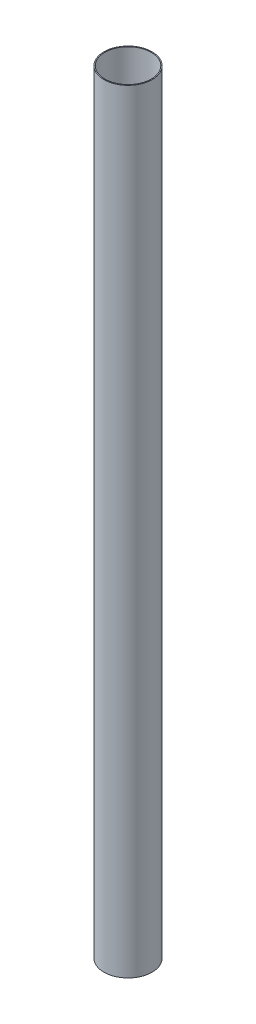
ISO-10303-21;
HEADER;
FILE_DESCRIPTION(('STEP AP214'),'2;1');
FILE_NAME('part.step','',(''),(''),'','','');
FILE_SCHEMA(('AUTOMOTIVE_DESIGN { 1 0 10303 214 1 1 1 1 }'));
ENDSEC;
DATA;
#1=APPLICATION_CONTEXT('core data for automotive mechanical design processes');
#2=APPLICATION_PROTOCOL_DEFINITION('international standard','automotive_design',2000,#1);
#3=PRODUCT_CONTEXT('',#1,'mechanical');
#4=PRODUCT('Part','Part','',(#3));
#5=PRODUCT_RELATED_PRODUCT_CATEGORY('part','',(#4));
#6=PRODUCT_DEFINITION_FORMATION('','',#4);
#7=PRODUCT_DEFINITION_CONTEXT('part definition',#1,'design');
#8=PRODUCT_DEFINITION('design','',#6,#7);
#9=PRODUCT_DEFINITION_SHAPE('','',#8);
#10=(LENGTH_UNIT() NAMED_UNIT(*) SI_UNIT(.MILLI.,.METRE.));
#11=(NAMED_UNIT(*) PLANE_ANGLE_UNIT() SI_UNIT($,.RADIAN.));
#12=(NAMED_UNIT(*) SI_UNIT($,.STERADIAN.) SOLID_ANGLE_UNIT());
#13=UNCERTAINTY_MEASURE_WITH_UNIT(LENGTH_MEASURE(1.E-05),#10,'distance_accuracy_value','');
#14=(GEOMETRIC_REPRESENTATION_CONTEXT(3) GLOBAL_UNCERTAINTY_ASSIGNED_CONTEXT((#13)) GLOBAL_UNIT_ASSIGNED_CONTEXT((#10,
#11,#12)) REPRESENTATION_CONTEXT('',''));
#15=CARTESIAN_POINT('',(0.,0.,0.));
#16=DIRECTION('',(0.,0.,1.));
#17=DIRECTION('',(1.,0.,0.));
#18=AXIS2_PLACEMENT_3D('',#15,#16,#17);
#19=CARTESIAN_POINT('',(0.,1270.,0.));
#20=DIRECTION('',(0.,1.,0.));
#21=DIRECTION('',(0.,0.,1.));
#22=AXIS2_PLACEMENT_3D('',#19,#20,#21);
#23=PLANE('',#22);
#24=CARTESIAN_POINT('',(0.,1270.,0.));
#25=DIRECTION('',(0.,1.,0.));
#26=DIRECTION('',(0.,0.,1.));
#27=AXIS2_PLACEMENT_3D('',#24,#25,#26);
#28=CIRCLE('',#27,39.624);
#29=CARTESIAN_POINT('',(0.,1270.,-39.624));
#30=VERTEX_POINT('',#29);
#31=EDGE_CURVE('E10',#30,#30,#28,.T.);
#32=ORIENTED_EDGE('',*,*,#31,.T.);
#33=EDGE_LOOP('',(#32));
#34=FACE_BOUND('',#33,.T.);
#35=CARTESIAN_POINT('',(0.,1270.,0.));
#36=DIRECTION('',(0.,1.,0.));
#37=DIRECTION('',(0.,0.,1.));
#38=AXIS2_PLACEMENT_3D('',#35,#36,#37);
#39=CIRCLE('',#38,38.1);
#40=CARTESIAN_POINT('',(0.,1270.,-38.1));
#41=VERTEX_POINT('',#40);
#42=EDGE_CURVE('E42',#41,#41,#39,.T.);
#43=ORIENTED_EDGE('',*,*,#42,.F.);
#44=EDGE_LOOP('',(#43));
#45=FACE_BOUND('',#44,.T.);
#46=ADVANCED_FACE('F31',(#34,#45),#23,.T.);
#47=CARTESIAN_POINT('',(0.,0.,0.));
#48=DIRECTION('',(0.,1.,0.));
#49=DIRECTION('',(0.,0.,1.));
#50=AXIS2_PLACEMENT_3D('',#47,#48,#49);
#51=PLANE('',#50);
#52=CARTESIAN_POINT('',(0.,0.,0.));
#53=DIRECTION('',(0.,1.,0.));
#54=DIRECTION('',(0.,0.,1.));
#55=AXIS2_PLACEMENT_3D('',#52,#53,#54);
#56=CIRCLE('',#55,39.624);
#57=CARTESIAN_POINT('',(0.,-2.22044604925031E-13,-39.624));
#58=VERTEX_POINT('',#57);
#59=EDGE_CURVE('E35',#58,#58,#56,.T.);
#60=ORIENTED_EDGE('',*,*,#59,.F.);
#61=EDGE_LOOP('',(#60));
#62=FACE_BOUND('',#61,.T.);
#63=CARTESIAN_POINT('',(0.,0.,0.));
#64=DIRECTION('',(0.,1.,0.));
#65=DIRECTION('',(0.,0.,1.));
#66=AXIS2_PLACEMENT_3D('',#63,#64,#65);
#67=CIRCLE('',#66,38.1);
#68=CARTESIAN_POINT('',(0.,-2.22044604925031E-13,-38.1));
#69=VERTEX_POINT('',#68);
#70=EDGE_CURVE('E44',#69,#69,#67,.T.);
#71=ORIENTED_EDGE('',*,*,#70,.T.);
#72=EDGE_LOOP('',(#71));
#73=FACE_BOUND('',#72,.T.);
#74=ADVANCED_FACE('F54',(#62,#73),#51,.F.);
#75=CARTESIAN_POINT('',(0.,1270.,0.));
#76=DIRECTION('',(0.,-1.,0.));
#77=DIRECTION('',(0.,0.,-1.));
#78=AXIS2_PLACEMENT_3D('',#75,#76,#77);
#79=CYLINDRICAL_SURFACE('',#78,39.624);
#80=CARTESIAN_POINT('',(0.,1270.,-39.624));
#81=CARTESIAN_POINT('',(0.,1256.77083333333,-39.624));
#82=CARTESIAN_POINT('',(0.,1243.54166666667,-39.624));
#83=CARTESIAN_POINT('',(0.,1217.08333333333,-39.624));
#84=CARTESIAN_POINT('',(0.,1203.85416666667,-39.624));
#85=CARTESIAN_POINT('',(0.,1177.39583333333,-39.624));
#86=CARTESIAN_POINT('',(0.,1164.16666666667,-39.624));
#87=CARTESIAN_POINT('',(0.,1137.70833333333,-39.624));
#88=CARTESIAN_POINT('',(0.,1124.47916666667,-39.624));
#89=CARTESIAN_POINT('',(0.,1098.02083333333,-39.624));
#90=CARTESIAN_POINT('',(0.,1084.79166666667,-39.624));
#91=CARTESIAN_POINT('',(0.,1058.33333333333,-39.624));
#92=CARTESIAN_POINT('',(0.,1045.10416666667,-39.624));
#93=CARTESIAN_POINT('',(0.,1018.64583333333,-39.624));
#94=CARTESIAN_POINT('',(0.,1005.41666666667,-39.624));
#95=CARTESIAN_POINT('',(0.,978.958333333333,-39.624));
#96=CARTESIAN_POINT('',(0.,965.729166666667,-39.624));
#97=CARTESIAN_POINT('',(0.,939.270833333333,-39.624));
#98=CARTESIAN_POINT('',(0.,926.041666666667,-39.624));
#99=CARTESIAN_POINT('',(0.,899.583333333333,-39.624));
#100=CARTESIAN_POINT('',(0.,886.354166666667,-39.624));
#101=CARTESIAN_POINT('',(0.,859.895833333333,-39.624));
#102=CARTESIAN_POINT('',(0.,846.666666666667,-39.624));
#103=CARTESIAN_POINT('',(0.,820.208333333333,-39.624));
#104=CARTESIAN_POINT('',(0.,806.979166666667,-39.624));
#105=CARTESIAN_POINT('',(0.,780.520833333333,-39.624));
#106=CARTESIAN_POINT('',(0.,767.291666666667,-39.624));
#107=CARTESIAN_POINT('',(0.,740.833333333333,-39.624));
#108=CARTESIAN_POINT('',(0.,727.604166666667,-39.624));
#109=CARTESIAN_POINT('',(0.,701.145833333333,-39.624));
#110=CARTESIAN_POINT('',(0.,687.916666666667,-39.624));
#111=CARTESIAN_POINT('',(0.,661.458333333333,-39.624));
#112=CARTESIAN_POINT('',(0.,648.229166666667,-39.624));
#113=CARTESIAN_POINT('',(0.,621.770833333333,-39.624));
#114=CARTESIAN_POINT('',(0.,608.541666666667,-39.624));
#115=CARTESIAN_POINT('',(0.,582.083333333333,-39.624));
#116=CARTESIAN_POINT('',(0.,568.854166666667,-39.624));
#117=CARTESIAN_POINT('',(0.,542.395833333333,-39.624));
#118=CARTESIAN_POINT('',(0.,529.166666666667,-39.624));
#119=CARTESIAN_POINT('',(0.,502.708333333333,-39.624));
#120=CARTESIAN_POINT('',(0.,489.479166666667,-39.624));
#121=CARTESIAN_POINT('',(0.,463.020833333333,-39.624));
#122=CARTESIAN_POINT('',(0.,449.791666666667,-39.624));
#123=CARTESIAN_POINT('',(0.,423.333333333333,-39.624));
#124=CARTESIAN_POINT('',(0.,410.104166666667,-39.624));
#125=CARTESIAN_POINT('',(0.,383.645833333333,-39.624));
#126=CARTESIAN_POINT('',(0.,370.416666666667,-39.624));
#127=CARTESIAN_POINT('',(0.,343.958333333333,-39.624));
#128=CARTESIAN_POINT('',(0.,330.729166666667,-39.624));
#129=CARTESIAN_POINT('',(0.,304.270833333333,-39.624));
#130=CARTESIAN_POINT('',(0.,291.041666666666,-39.624));
#131=CARTESIAN_POINT('',(0.,264.583333333333,-39.624));
#132=CARTESIAN_POINT('',(0.,251.354166666667,-39.624));
#133=CARTESIAN_POINT('',(0.,224.895833333333,-39.624));
#134=CARTESIAN_POINT('',(0.,211.666666666667,-39.624));
#135=CARTESIAN_POINT('',(0.,185.208333333333,-39.624));
#136=CARTESIAN_POINT('',(0.,171.979166666666,-39.624));
#137=CARTESIAN_POINT('',(0.,145.520833333333,-39.624));
#138=CARTESIAN_POINT('',(0.,132.291666666666,-39.624));
#139=CARTESIAN_POINT('',(0.,105.833333333333,-39.624));
#140=CARTESIAN_POINT('',(0.,92.6041666666664,-39.624));
#141=CARTESIAN_POINT('',(0.,66.1458333333331,-39.624));
#142=CARTESIAN_POINT('',(0.,52.9166666666665,-39.624));
#143=CARTESIAN_POINT('',(0.,26.4583333333332,-39.624));
#144=CARTESIAN_POINT('',(0.,13.2291666666665,-39.624));
#145=CARTESIAN_POINT('',(0.,-2.22044604925031E-13,-39.624));
#146=B_SPLINE_CURVE_WITH_KNOTS('',3,(#80,#81,#82,#83,#84,#85,#86,#87,#88,#89,#90,#91,#92,#93,
#94,#95,#96,#97,#98,#99,#100,#101,#102,#103,#104,#105,#106,#107,#108,#109,#110,#111,#112,#113,
#114,#115,#116,#117,#118,#119,#120,#121,#122,#123,#124,#125,#126,#127,#128,#129,#130,#131,#132,
#133,#134,#135,#136,#137,#138,#139,#140,#141,#142,#143,#144,#145),.UNSPECIFIED.,.F.,.F.,(4,2,2,
2,2,2,2,2,2,2,2,2,2,2,2,2,2,2,2,2,2,2,2,2,2,2,2,2,2,2,2,2,4),(0.,39.6874999999999,79.375,
119.0625,158.75,198.4375,238.125,277.8125,317.5,357.1875,396.875,436.5625,476.25,515.9375,
555.625,595.3125,635.,674.6875,714.375,754.0625,793.75,833.4375,873.125,912.8125,952.5,992.1875,
1031.875,1071.5625,1111.25,1150.9375,1190.625,1230.3125,1270.),.UNSPECIFIED.);
#147=EDGE_CURVE('BSEAM33',#30,#58,#146,.T.);
#148=ORIENTED_EDGE('',*,*,#31,.F.);
#149=ORIENTED_EDGE('',*,*,#59,.T.);
#150=ORIENTED_EDGE('',*,*,#147,.T.);
#151=ORIENTED_EDGE('',*,*,#147,.F.);
#152=EDGE_LOOP('',(#148,#150,#149,#151));
#153=FACE_BOUND('',#152,.T.);
#154=ADVANCED_FACE('F33',(#153),#79,.T.);
#155=CARTESIAN_POINT('',(0.,1270.,0.));
#156=DIRECTION('',(0.,-1.,0.));
#157=DIRECTION('',(0.,0.,-1.));
#158=AXIS2_PLACEMENT_3D('',#155,#156,#157);
#159=CYLINDRICAL_SURFACE('',#158,38.1);
#160=CARTESIAN_POINT('',(0.,1270.,-38.1));
#161=CARTESIAN_POINT('',(0.,1256.77083333333,-38.1));
#162=CARTESIAN_POINT('',(0.,1243.54166666667,-38.1));
#163=CARTESIAN_POINT('',(0.,1217.08333333333,-38.1));
#164=CARTESIAN_POINT('',(0.,1203.85416666667,-38.1));
#165=CARTESIAN_POINT('',(0.,1177.39583333333,-38.1));
#166=CARTESIAN_POINT('',(0.,1164.16666666667,-38.1));
#167=CARTESIAN_POINT('',(0.,1137.70833333333,-38.1));
#168=CARTESIAN_POINT('',(0.,1124.47916666667,-38.1));
#169=CARTESIAN_POINT('',(0.,1098.02083333333,-38.1));
#170=CARTESIAN_POINT('',(0.,1084.79166666667,-38.1));
#171=CARTESIAN_POINT('',(0.,1058.33333333333,-38.1));
#172=CARTESIAN_POINT('',(0.,1045.10416666667,-38.1));
#173=CARTESIAN_POINT('',(0.,1018.64583333333,-38.1));
#174=CARTESIAN_POINT('',(0.,1005.41666666667,-38.1));
#175=CARTESIAN_POINT('',(0.,978.958333333333,-38.1));
#176=CARTESIAN_POINT('',(0.,965.729166666667,-38.1));
#177=CARTESIAN_POINT('',(0.,939.270833333333,-38.1));
#178=CARTESIAN_POINT('',(0.,926.041666666667,-38.1));
#179=CARTESIAN_POINT('',(0.,899.583333333333,-38.1));
#180=CARTESIAN_POINT('',(0.,886.354166666667,-38.1));
#181=CARTESIAN_POINT('',(0.,859.895833333333,-38.1));
#182=CARTESIAN_POINT('',(0.,846.666666666667,-38.1));
#183=CARTESIAN_POINT('',(0.,820.208333333333,-38.1));
#184=CARTESIAN_POINT('',(0.,806.979166666667,-38.1));
#185=CARTESIAN_POINT('',(0.,780.520833333333,-38.1));
#186=CARTESIAN_POINT('',(0.,767.291666666667,-38.1));
#187=CARTESIAN_POINT('',(0.,740.833333333333,-38.1));
#188=CARTESIAN_POINT('',(0.,727.604166666667,-38.1));
#189=CARTESIAN_POINT('',(0.,701.145833333333,-38.1));
#190=CARTESIAN_POINT('',(0.,687.916666666667,-38.1));
#191=CARTESIAN_POINT('',(0.,661.458333333333,-38.1));
#192=CARTESIAN_POINT('',(0.,648.229166666667,-38.1));
#193=CARTESIAN_POINT('',(0.,621.770833333333,-38.1));
#194=CARTESIAN_POINT('',(0.,608.541666666667,-38.1));
#195=CARTESIAN_POINT('',(0.,582.083333333333,-38.1));
#196=CARTESIAN_POINT('',(0.,568.854166666667,-38.1));
#197=CARTESIAN_POINT('',(0.,542.395833333333,-38.1));
#198=CARTESIAN_POINT('',(0.,529.166666666667,-38.1));
#199=CARTESIAN_POINT('',(0.,502.708333333333,-38.1));
#200=CARTESIAN_POINT('',(0.,489.479166666667,-38.1));
#201=CARTESIAN_POINT('',(0.,463.020833333333,-38.1));
#202=CARTESIAN_POINT('',(0.,449.791666666667,-38.1));
#203=CARTESIAN_POINT('',(0.,423.333333333333,-38.1));
#204=CARTESIAN_POINT('',(0.,410.104166666667,-38.1));
#205=CARTESIAN_POINT('',(0.,383.645833333333,-38.1));
#206=CARTESIAN_POINT('',(0.,370.416666666667,-38.1));
#207=CARTESIAN_POINT('',(0.,343.958333333333,-38.1));
#208=CARTESIAN_POINT('',(0.,330.729166666667,-38.1));
#209=CARTESIAN_POINT('',(0.,304.270833333333,-38.1));
#210=CARTESIAN_POINT('',(0.,291.041666666666,-38.1));
#211=CARTESIAN_POINT('',(0.,264.583333333333,-38.1));
#212=CARTESIAN_POINT('',(0.,251.354166666667,-38.1));
#213=CARTESIAN_POINT('',(0.,224.895833333333,-38.1));
#214=CARTESIAN_POINT('',(0.,211.666666666667,-38.1));
#215=CARTESIAN_POINT('',(0.,185.208333333333,-38.1));
#216=CARTESIAN_POINT('',(0.,171.979166666666,-38.1));
#217=CARTESIAN_POINT('',(0.,145.520833333333,-38.1));
#218=CARTESIAN_POINT('',(0.,132.291666666666,-38.1));
#219=CARTESIAN_POINT('',(0.,105.833333333333,-38.1));
#220=CARTESIAN_POINT('',(0.,92.6041666666664,-38.1));
#221=CARTESIAN_POINT('',(0.,66.1458333333331,-38.1));
#222=CARTESIAN_POINT('',(0.,52.9166666666665,-38.1));
#223=CARTESIAN_POINT('',(0.,26.4583333333332,-38.1));
#224=CARTESIAN_POINT('',(0.,13.2291666666665,-38.1));
#225=CARTESIAN_POINT('',(0.,-2.22044604925031E-13,-38.1));
#226=B_SPLINE_CURVE_WITH_KNOTS('',3,(#160,#161,#162,#163,#164,#165,#166,#167,#168,#169,#170,
#171,#172,#173,#174,#175,#176,#177,#178,#179,#180,#181,#182,#183,#184,#185,#186,#187,#188,#189,
#190,#191,#192,#193,#194,#195,#196,#197,#198,#199,#200,#201,#202,#203,#204,#205,#206,#207,#208,
#209,#210,#211,#212,#213,#214,#215,#216,#217,#218,#219,#220,#221,#222,#223,#224,#225),
.UNSPECIFIED.,.F.,.F.,(4,2,2,2,2,2,2,2,2,2,2,2,2,2,2,2,2,2,2,2,2,2,2,2,2,2,2,2,2,2,2,2,4),(0.,
39.6874999999999,79.375,119.0625,158.75,198.4375,238.125,277.8125,317.5,357.1875,396.875,
436.5625,476.25,515.9375,555.625,595.3125,635.,674.6875,714.375,754.0625,793.75,833.4375,
873.125,912.8125,952.5,992.1875,1031.875,1071.5625,1111.25,1150.9375,1190.625,1230.3125,1270.),.UNSPECIFIED.);
#227=EDGE_CURVE('BSEAM50',#41,#69,#226,.T.);
#228=ORIENTED_EDGE('',*,*,#42,.T.);
#229=ORIENTED_EDGE('',*,*,#70,.F.);
#230=ORIENTED_EDGE('',*,*,#227,.T.);
#231=ORIENTED_EDGE('',*,*,#227,.F.);
#232=EDGE_LOOP('',(#228,#230,#229,#231));
#233=FACE_BOUND('',#232,.T.);
#234=ADVANCED_FACE('F50',(#233),#159,.F.);
#235=CLOSED_SHELL('',(#46,#74,#154,#234));
#236=MANIFOLD_SOLID_BREP('B2',#235);
#237=ADVANCED_BREP_SHAPE_REPRESENTATION('',(#18,#236),#14);
#238=SHAPE_DEFINITION_REPRESENTATION(#9,#237);
ENDSEC;
END-ISO-10303-21;
